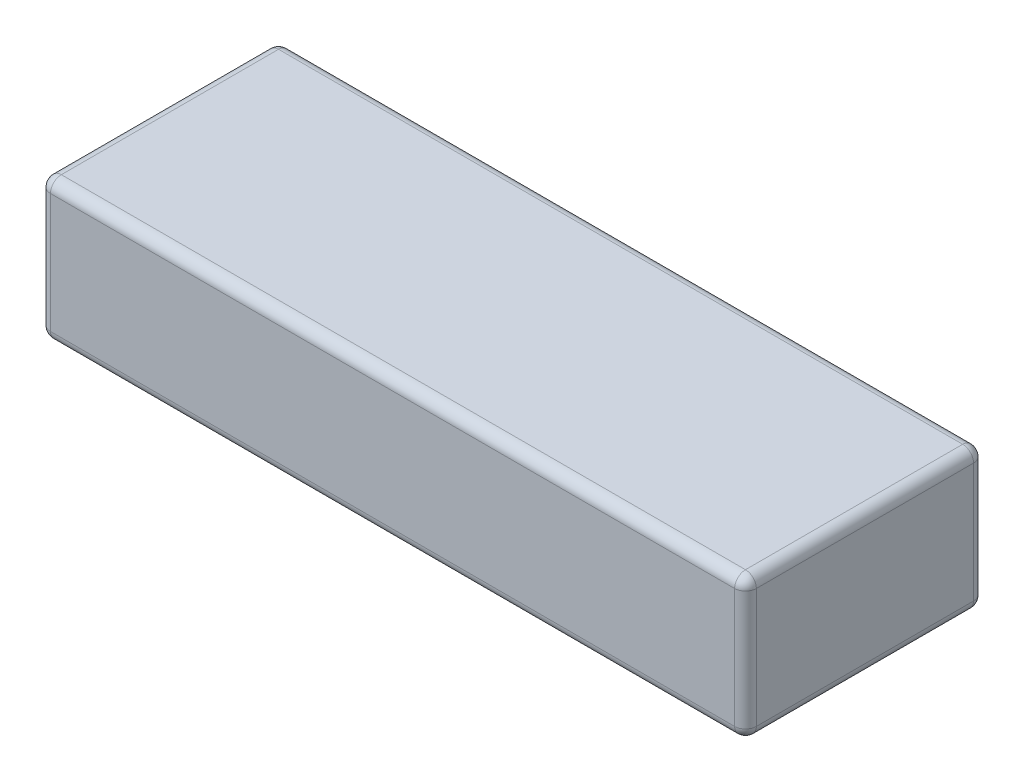
ISO-10303-21;
HEADER;
FILE_DESCRIPTION(('STEP AP214'),'2;1');
FILE_NAME('part.step','',(''),(''),'','','');
FILE_SCHEMA(('AUTOMOTIVE_DESIGN { 1 0 10303 214 1 1 1 1 }'));
ENDSEC;
DATA;
#1=APPLICATION_CONTEXT('core data for automotive mechanical design processes');
#2=APPLICATION_PROTOCOL_DEFINITION('international standard','automotive_design',2000,#1);
#3=PRODUCT_CONTEXT('',#1,'mechanical');
#4=PRODUCT('Part','Part','',(#3));
#5=PRODUCT_RELATED_PRODUCT_CATEGORY('part','',(#4));
#6=PRODUCT_DEFINITION_FORMATION('','',#4);
#7=PRODUCT_DEFINITION_CONTEXT('part definition',#1,'design');
#8=PRODUCT_DEFINITION('design','',#6,#7);
#9=PRODUCT_DEFINITION_SHAPE('','',#8);
#10=(LENGTH_UNIT() NAMED_UNIT(*) SI_UNIT(.MILLI.,.METRE.));
#11=(NAMED_UNIT(*) PLANE_ANGLE_UNIT() SI_UNIT($,.RADIAN.));
#12=(NAMED_UNIT(*) SI_UNIT($,.STERADIAN.) SOLID_ANGLE_UNIT());
#13=UNCERTAINTY_MEASURE_WITH_UNIT(LENGTH_MEASURE(1.E-05),#10,'distance_accuracy_value','');
#14=(GEOMETRIC_REPRESENTATION_CONTEXT(3) GLOBAL_UNCERTAINTY_ASSIGNED_CONTEXT((#13)) GLOBAL_UNIT_ASSIGNED_CONTEXT((#10,
#11,#12)) REPRESENTATION_CONTEXT('',''));
#15=CARTESIAN_POINT('',(0.,0.,0.));
#16=DIRECTION('',(0.,0.,1.));
#17=DIRECTION('',(1.,0.,0.));
#18=AXIS2_PLACEMENT_3D('',#15,#16,#17);
#19=CARTESIAN_POINT('',(-61.7927631578948,26.,-27.4292763157895));
#20=DIRECTION('',(1.,0.,0.));
#21=DIRECTION('',(0.,0.,-1.));
#22=AXIS2_PLACEMENT_3D('',#19,#20,#21);
#23=PLANE('',#22);
#24=DIRECTION('',(0.,0.,1.));
#25=VECTOR('',#24,1.);
#26=CARTESIAN_POINT('',(-61.7927631578948,2.,-27.4292763157895));
#27=LINE('',#26,#25);
#28=CARTESIAN_POINT('',(-61.7927631578948,2.,-25.4292763157895));
#29=VERTEX_POINT('',#28);
#30=CARTESIAN_POINT('',(-61.7927631578948,2.,14.5707236842105));
#31=VERTEX_POINT('',#30);
#32=EDGE_CURVE('E188',#29,#31,#27,.T.);
#33=ORIENTED_EDGE('',*,*,#32,.T.);
#34=DIRECTION('',(0.,-1.,0.));
#35=VECTOR('',#34,1.);
#36=CARTESIAN_POINT('',(-61.7927631578948,26.,14.5707236842105));
#37=LINE('',#36,#35);
#38=CARTESIAN_POINT('',(-61.7927631578948,24.,14.5707236842105));
#39=VERTEX_POINT('',#38);
#40=EDGE_CURVE('E191',#31,#39,#37,.F.);
#41=ORIENTED_EDGE('',*,*,#40,.T.);
#42=DIRECTION('',(0.,0.,1.));
#43=VECTOR('',#42,1.);
#44=CARTESIAN_POINT('',(-61.7927631578948,24.,-27.4292763157895));
#45=LINE('',#44,#43);
#46=CARTESIAN_POINT('',(-61.7927631578948,24.,-25.4292763157895));
#47=VERTEX_POINT('',#46);
#48=EDGE_CURVE('E185',#39,#47,#45,.F.);
#49=ORIENTED_EDGE('',*,*,#48,.T.);
#50=DIRECTION('',(0.,-1.,0.));
#51=VECTOR('',#50,1.);
#52=CARTESIAN_POINT('',(-61.7927631578948,26.,-25.4292763157895));
#53=LINE('',#52,#51);
#54=EDGE_CURVE('E182',#47,#29,#53,.T.);
#55=ORIENTED_EDGE('',*,*,#54,.T.);
#56=EDGE_LOOP('',(#33,#41,#49,#55));
#57=FACE_BOUND('',#56,.T.);
#58=ADVANCED_FACE('F45',(#57),#23,.F.);
#59=CARTESIAN_POINT('',(-61.7927631578948,26.,16.5707236842105));
#60=DIRECTION('',(0.,0.,-1.));
#61=DIRECTION('',(-1.,0.,0.));
#62=AXIS2_PLACEMENT_3D('',#59,#60,#61);
#63=PLANE('',#62);
#64=DIRECTION('',(1.,0.,0.));
#65=VECTOR('',#64,1.);
#66=CARTESIAN_POINT('',(-61.7927631578948,24.,16.5707236842105));
#67=LINE('',#66,#65);
#68=CARTESIAN_POINT('',(66.2072368421052,24.,16.5707236842105));
#69=VERTEX_POINT('',#68);
#70=CARTESIAN_POINT('',(-59.7927631578948,24.,16.5707236842105));
#71=VERTEX_POINT('',#70);
#72=EDGE_CURVE('E138',#69,#71,#67,.F.);
#73=ORIENTED_EDGE('',*,*,#72,.T.);
#74=DIRECTION('',(0.,-1.,0.));
#75=VECTOR('',#74,1.);
#76=CARTESIAN_POINT('',(-59.7927631578948,26.,16.5707236842105));
#77=LINE('',#76,#75);
#78=CARTESIAN_POINT('',(-59.7927631578948,2.,16.5707236842105));
#79=VERTEX_POINT('',#78);
#80=EDGE_CURVE('E179',#71,#79,#77,.T.);
#81=ORIENTED_EDGE('',*,*,#80,.T.);
#82=DIRECTION('',(1.,0.,0.));
#83=VECTOR('',#82,1.);
#84=CARTESIAN_POINT('',(-61.7927631578948,2.,16.5707236842105));
#85=LINE('',#84,#83);
#86=CARTESIAN_POINT('',(66.2072368421052,2.,16.5707236842105));
#87=VERTEX_POINT('',#86);
#88=EDGE_CURVE('E141',#79,#87,#85,.T.);
#89=ORIENTED_EDGE('',*,*,#88,.T.);
#90=DIRECTION('',(0.,-1.,0.));
#91=VECTOR('',#90,1.);
#92=CARTESIAN_POINT('',(66.2072368421052,26.,16.5707236842105));
#93=LINE('',#92,#91);
#94=EDGE_CURVE('E133',#87,#69,#93,.F.);
#95=ORIENTED_EDGE('',*,*,#94,.T.);
#96=EDGE_LOOP('',(#73,#81,#89,#95));
#97=FACE_BOUND('',#96,.T.);
#98=ADVANCED_FACE('F135',(#97),#63,.F.);
#99=CARTESIAN_POINT('',(68.2072368421052,26.,-27.4292763157895));
#100=DIRECTION('',(-1.,0.,0.));
#101=DIRECTION('',(0.,0.,1.));
#102=AXIS2_PLACEMENT_3D('',#99,#100,#101);
#103=PLANE('',#102);
#104=DIRECTION('',(0.,0.,-1.));
#105=VECTOR('',#104,1.);
#106=CARTESIAN_POINT('',(68.2072368421052,2.,-27.4292763157895));
#107=LINE('',#106,#105);
#108=CARTESIAN_POINT('',(68.2072368421052,2.,14.5707236842105));
#109=VERTEX_POINT('',#108);
#110=CARTESIAN_POINT('',(68.2072368421052,2.,-25.4292763157895));
#111=VERTEX_POINT('',#110);
#112=EDGE_CURVE('E55',#109,#111,#107,.T.);
#113=ORIENTED_EDGE('',*,*,#112,.T.);
#114=DIRECTION('',(0.,-1.,0.));
#115=VECTOR('',#114,1.);
#116=CARTESIAN_POINT('',(68.2072368421052,26.,-25.4292763157895));
#117=LINE('',#116,#115);
#118=CARTESIAN_POINT('',(68.2072368421052,24.,-25.4292763157895));
#119=VERTEX_POINT('',#118);
#120=EDGE_CURVE('E11',#111,#119,#117,.F.);
#121=ORIENTED_EDGE('',*,*,#120,.T.);
#122=DIRECTION('',(0.,0.,-1.));
#123=VECTOR('',#122,1.);
#124=CARTESIAN_POINT('',(68.2072368421052,24.,16.5707236842105));
#125=LINE('',#124,#123);
#126=CARTESIAN_POINT('',(68.2072368421052,24.,14.5707236842105));
#127=VERTEX_POINT('',#126);
#128=EDGE_CURVE('E234',#119,#127,#125,.F.);
#129=ORIENTED_EDGE('',*,*,#128,.T.);
#130=DIRECTION('',(0.,-1.,0.));
#131=VECTOR('',#130,1.);
#132=CARTESIAN_POINT('',(68.2072368421052,26.,14.5707236842105));
#133=LINE('',#132,#131);
#134=EDGE_CURVE('E66',#127,#109,#133,.T.);
#135=ORIENTED_EDGE('',*,*,#134,.T.);
#136=EDGE_LOOP('',(#113,#121,#129,#135));
#137=FACE_BOUND('',#136,.T.);
#138=ADVANCED_FACE('F370',(#137),#103,.F.);
#139=CARTESIAN_POINT('',(-61.7927631578948,26.,-27.4292763157895));
#140=DIRECTION('',(0.,0.,1.));
#141=DIRECTION('',(1.,0.,0.));
#142=AXIS2_PLACEMENT_3D('',#139,#140,#141);
#143=PLANE('',#142);
#144=DIRECTION('',(0.,-1.,0.));
#145=VECTOR('',#144,1.);
#146=CARTESIAN_POINT('',(-59.7927631578948,26.,-27.4292763157895));
#147=LINE('',#146,#145);
#148=CARTESIAN_POINT('',(-59.7927631578948,2.,-27.4292763157895));
#149=VERTEX_POINT('',#148);
#150=CARTESIAN_POINT('',(-59.7927631578948,24.,-27.4292763157895));
#151=VERTEX_POINT('',#150);
#152=EDGE_CURVE('E227',#149,#151,#147,.F.);
#153=ORIENTED_EDGE('',*,*,#152,.T.);
#154=DIRECTION('',(-1.,0.,0.));
#155=VECTOR('',#154,1.);
#156=CARTESIAN_POINT('',(68.2072368421052,24.,-27.4292763157895));
#157=LINE('',#156,#155);
#158=CARTESIAN_POINT('',(66.2072368421052,24.,-27.4292763157895));
#159=VERTEX_POINT('',#158);
#160=EDGE_CURVE('E230',#151,#159,#157,.F.);
#161=ORIENTED_EDGE('',*,*,#160,.T.);
#162=DIRECTION('',(0.,-1.,0.));
#163=VECTOR('',#162,1.);
#164=CARTESIAN_POINT('',(66.2072368421052,26.,-27.4292763157895));
#165=LINE('',#164,#163);
#166=CARTESIAN_POINT('',(66.2072368421052,2.,-27.4292763157895));
#167=VERTEX_POINT('',#166);
#168=EDGE_CURVE('E221',#159,#167,#165,.T.);
#169=ORIENTED_EDGE('',*,*,#168,.T.);
#170=DIRECTION('',(-1.,0.,0.));
#171=VECTOR('',#170,1.);
#172=CARTESIAN_POINT('',(-61.7927631578948,2.,-27.4292763157895));
#173=LINE('',#172,#171);
#174=EDGE_CURVE('E224',#167,#149,#173,.T.);
#175=ORIENTED_EDGE('',*,*,#174,.T.);
#176=EDGE_LOOP('',(#153,#161,#169,#175));
#177=FACE_BOUND('',#176,.T.);
#178=ADVANCED_FACE('F333',(#177),#143,.F.);
#179=CARTESIAN_POINT('',(0.,26.,0.));
#180=DIRECTION('',(0.,1.,0.));
#181=DIRECTION('',(0.,0.,1.));
#182=AXIS2_PLACEMENT_3D('',#179,#180,#181);
#183=PLANE('',#182);
#184=DIRECTION('',(0.,0.,-1.));
#185=VECTOR('',#184,1.);
#186=CARTESIAN_POINT('',(66.2072368421052,26.,-27.4292763157895));
#187=LINE('',#186,#185);
#188=CARTESIAN_POINT('',(66.2072368421052,26.,14.5707236842105));
#189=VERTEX_POINT('',#188);
#190=CARTESIAN_POINT('',(66.2072368421052,26.,-25.4292763157895));
#191=VERTEX_POINT('',#190);
#192=EDGE_CURVE('E211',#189,#191,#187,.T.);
#193=ORIENTED_EDGE('',*,*,#192,.T.);
#194=DIRECTION('',(-1.,0.,0.));
#195=VECTOR('',#194,1.);
#196=CARTESIAN_POINT('',(-61.7927631578948,26.,-25.4292763157895));
#197=LINE('',#196,#195);
#198=CARTESIAN_POINT('',(-59.7927631578948,26.,-25.4292763157895));
#199=VERTEX_POINT('',#198);
#200=EDGE_CURVE('E217',#191,#199,#197,.T.);
#201=ORIENTED_EDGE('',*,*,#200,.T.);
#202=DIRECTION('',(0.,0.,1.));
#203=VECTOR('',#202,1.);
#204=CARTESIAN_POINT('',(-59.7927631578948,26.,16.5707236842105));
#205=LINE('',#204,#203);
#206=CARTESIAN_POINT('',(-59.7927631578948,26.,14.5707236842105));
#207=VERTEX_POINT('',#206);
#208=EDGE_CURVE('E214',#199,#207,#205,.T.);
#209=ORIENTED_EDGE('',*,*,#208,.T.);
#210=DIRECTION('',(1.,0.,0.));
#211=VECTOR('',#210,1.);
#212=CARTESIAN_POINT('',(68.2072368421052,26.,14.5707236842105));
#213=LINE('',#212,#211);
#214=EDGE_CURVE('E208',#207,#189,#213,.T.);
#215=ORIENTED_EDGE('',*,*,#214,.T.);
#216=EDGE_LOOP('',(#193,#201,#209,#215));
#217=FACE_BOUND('',#216,.T.);
#218=ADVANCED_FACE('F349',(#217),#183,.T.);
#219=CARTESIAN_POINT('',(0.,0.,0.));
#220=DIRECTION('',(0.,1.,0.));
#221=DIRECTION('',(0.,0.,1.));
#222=AXIS2_PLACEMENT_3D('',#219,#220,#221);
#223=PLANE('',#222);
#224=DIRECTION('',(1.,0.,0.));
#225=VECTOR('',#224,1.);
#226=CARTESIAN_POINT('',(0.,0.,14.5707236842105));
#227=LINE('',#226,#225);
#228=CARTESIAN_POINT('',(66.2072368421052,0.,14.5707236842105));
#229=VERTEX_POINT('',#228);
#230=CARTESIAN_POINT('',(-59.7927631578948,0.,14.5707236842105));
#231=VERTEX_POINT('',#230);
#232=EDGE_CURVE('E198',#229,#231,#227,.F.);
#233=ORIENTED_EDGE('',*,*,#232,.T.);
#234=DIRECTION('',(0.,0.,1.));
#235=VECTOR('',#234,1.);
#236=CARTESIAN_POINT('',(-59.7927631578948,0.,0.));
#237=LINE('',#236,#235);
#238=CARTESIAN_POINT('',(-59.7927631578948,0.,-25.4292763157895));
#239=VERTEX_POINT('',#238);
#240=EDGE_CURVE('E204',#231,#239,#237,.F.);
#241=ORIENTED_EDGE('',*,*,#240,.T.);
#242=DIRECTION('',(-1.,0.,0.));
#243=VECTOR('',#242,1.);
#244=CARTESIAN_POINT('',(0.,0.,-25.4292763157895));
#245=LINE('',#244,#243);
#246=CARTESIAN_POINT('',(66.2072368421052,0.,-25.4292763157895));
#247=VERTEX_POINT('',#246);
#248=EDGE_CURVE('E201',#239,#247,#245,.F.);
#249=ORIENTED_EDGE('',*,*,#248,.T.);
#250=DIRECTION('',(0.,0.,-1.));
#251=VECTOR('',#250,1.);
#252=CARTESIAN_POINT('',(66.2072368421052,0.,0.));
#253=LINE('',#252,#251);
#254=EDGE_CURVE('E195',#247,#229,#253,.F.);
#255=ORIENTED_EDGE('',*,*,#254,.T.);
#256=EDGE_LOOP('',(#233,#241,#249,#255));
#257=FACE_BOUND('',#256,.T.);
#258=ADVANCED_FACE('F324',(#257),#223,.F.);
#259=CARTESIAN_POINT('',(66.2072368421052,26.,-25.4292763157895));
#260=DIRECTION('',(0.,-1.,0.));
#261=DIRECTION('',(0.,0.,-1.));
#262=AXIS2_PLACEMENT_3D('',#259,#260,#261);
#263=CYLINDRICAL_SURFACE('',#262,2.);
#264=CARTESIAN_POINT('',(66.2072368421052,24.,-25.4292763157895));
#265=DIRECTION('',(0.,1.,0.));
#266=DIRECTION('',(0.,0.,1.));
#267=AXIS2_PLACEMENT_3D('',#264,#265,#266);
#268=CIRCLE('',#267,2.);
#269=EDGE_CURVE('E49',#119,#159,#268,.T.);
#270=ORIENTED_EDGE('',*,*,#269,.F.);
#271=ORIENTED_EDGE('',*,*,#120,.F.);
#272=CARTESIAN_POINT('',(66.2072368421052,2.,-25.4292763157895));
#273=DIRECTION('',(0.,-1.,0.));
#274=DIRECTION('',(0.,0.,-1.));
#275=AXIS2_PLACEMENT_3D('',#272,#273,#274);
#276=CIRCLE('',#275,2.);
#277=EDGE_CURVE('E175',#167,#111,#276,.T.);
#278=ORIENTED_EDGE('',*,*,#277,.F.);
#279=ORIENTED_EDGE('',*,*,#168,.F.);
#280=EDGE_LOOP('',(#270,#271,#278,#279));
#281=FACE_BOUND('',#280,.T.);
#282=ADVANCED_FACE('F47',(#281),#263,.T.);
#283=CARTESIAN_POINT('',(66.2072368421052,24.,-25.4292763157895));
#284=DIRECTION('',(0.,0.,-1.));
#285=DIRECTION('',(-1.,0.,0.));
#286=AXIS2_PLACEMENT_3D('',#283,#284,#285);
#287=SPHERICAL_SURFACE('',#286,2.);
#288=CARTESIAN_POINT('',(66.2072368421052,24.,-25.4292763157895));
#289=DIRECTION('',(0.,0.,-1.));
#290=DIRECTION('',(-1.,0.,0.));
#291=AXIS2_PLACEMENT_3D('',#288,#289,#290);
#292=CIRCLE('',#291,2.);
#293=EDGE_CURVE('E302',#119,#191,#292,.F.);
#294=ORIENTED_EDGE('',*,*,#293,.F.);
#295=ORIENTED_EDGE('',*,*,#269,.T.);
#296=CARTESIAN_POINT('',(66.2072368421052,24.,-25.4292763157895));
#297=DIRECTION('',(1.,0.,0.));
#298=DIRECTION('',(0.,1.,0.));
#299=AXIS2_PLACEMENT_3D('',#296,#297,#298);
#300=CIRCLE('',#299,2.);
#301=EDGE_CURVE('E306',#191,#159,#300,.F.);
#302=ORIENTED_EDGE('',*,*,#301,.F.);
#303=EDGE_LOOP('',(#294,#295,#302));
#304=FACE_BOUND('',#303,.T.);
#305=ADVANCED_FACE('F357',(#304),#287,.T.);
#306=CARTESIAN_POINT('',(66.2072368421052,2.,-25.4292763157895));
#307=DIRECTION('',(1.,0.,0.));
#308=DIRECTION('',(0.,1.,0.));
#309=AXIS2_PLACEMENT_3D('',#306,#307,#308);
#310=SPHERICAL_SURFACE('',#309,2.);
#311=CARTESIAN_POINT('',(66.2072368421052,2.,-25.4292763157895));
#312=DIRECTION('',(1.,0.,0.));
#313=DIRECTION('',(0.,0.,-1.));
#314=AXIS2_PLACEMENT_3D('',#311,#312,#313);
#315=CIRCLE('',#314,2.);
#316=EDGE_CURVE('E294',#167,#247,#315,.F.);
#317=ORIENTED_EDGE('',*,*,#316,.F.);
#318=ORIENTED_EDGE('',*,*,#277,.T.);
#319=CARTESIAN_POINT('',(66.2072368421052,2.,-25.4292763157895));
#320=DIRECTION('',(0.,0.,-1.));
#321=DIRECTION('',(-1.,0.,0.));
#322=AXIS2_PLACEMENT_3D('',#319,#320,#321);
#323=CIRCLE('',#322,2.);
#324=EDGE_CURVE('E298',#247,#111,#323,.F.);
#325=ORIENTED_EDGE('',*,*,#324,.F.);
#326=EDGE_LOOP('',(#317,#318,#325));
#327=FACE_BOUND('',#326,.T.);
#328=ADVANCED_FACE('F314',(#327),#310,.T.);
#329=CARTESIAN_POINT('',(0.,24.,-25.4292763157895));
#330=DIRECTION('',(1.,0.,0.));
#331=DIRECTION('',(0.,0.,-1.));
#332=AXIS2_PLACEMENT_3D('',#329,#330,#331);
#333=CYLINDRICAL_SURFACE('',#332,2.);
#334=ORIENTED_EDGE('',*,*,#301,.T.);
#335=ORIENTED_EDGE('',*,*,#160,.F.);
#336=CARTESIAN_POINT('',(-59.7927631578948,24.,-25.4292763157895));
#337=DIRECTION('',(-1.,0.,0.));
#338=DIRECTION('',(0.,0.,1.));
#339=AXIS2_PLACEMENT_3D('',#336,#337,#338);
#340=CIRCLE('',#339,2.);
#341=EDGE_CURVE('E286',#199,#151,#340,.T.);
#342=ORIENTED_EDGE('',*,*,#341,.F.);
#343=ORIENTED_EDGE('',*,*,#200,.F.);
#344=EDGE_LOOP('',(#334,#335,#342,#343));
#345=FACE_BOUND('',#344,.T.);
#346=ADVANCED_FACE('F347',(#345),#333,.T.);
#347=CARTESIAN_POINT('',(66.2072368421052,24.,0.));
#348=DIRECTION('',(0.,0.,1.));
#349=DIRECTION('',(1.,0.,0.));
#350=AXIS2_PLACEMENT_3D('',#347,#348,#349);
#351=CYLINDRICAL_SURFACE('',#350,2.);
#352=ORIENTED_EDGE('',*,*,#293,.T.);
#353=ORIENTED_EDGE('',*,*,#192,.F.);
#354=CARTESIAN_POINT('',(66.2072368421052,24.,14.5707236842105));
#355=DIRECTION('',(0.,0.,1.));
#356=DIRECTION('',(0.,-1.,0.));
#357=AXIS2_PLACEMENT_3D('',#354,#355,#356);
#358=CIRCLE('',#357,2.);
#359=EDGE_CURVE('E155',#127,#189,#358,.T.);
#360=ORIENTED_EDGE('',*,*,#359,.F.);
#361=ORIENTED_EDGE('',*,*,#128,.F.);
#362=EDGE_LOOP('',(#352,#353,#360,#361));
#363=FACE_BOUND('',#362,.T.);
#364=ADVANCED_FACE('F354',(#363),#351,.T.);
#365=CARTESIAN_POINT('',(66.2072368421052,26.,14.5707236842105));
#366=DIRECTION('',(0.,-1.,0.));
#367=DIRECTION('',(0.,0.,-1.));
#368=AXIS2_PLACEMENT_3D('',#365,#366,#367);
#369=CYLINDRICAL_SURFACE('',#368,2.);
#370=CARTESIAN_POINT('',(66.2072368421052,2.,14.5707236842105));
#371=DIRECTION('',(0.,-1.,0.));
#372=DIRECTION('',(0.,0.,-1.));
#373=AXIS2_PLACEMENT_3D('',#370,#371,#372);
#374=CIRCLE('',#373,2.);
#375=EDGE_CURVE('E156',#109,#87,#374,.T.);
#376=ORIENTED_EDGE('',*,*,#375,.F.);
#377=ORIENTED_EDGE('',*,*,#134,.F.);
#378=CARTESIAN_POINT('',(66.2072368421052,24.,14.5707236842105));
#379=DIRECTION('',(0.,1.,0.));
#380=DIRECTION('',(0.,0.,1.));
#381=AXIS2_PLACEMENT_3D('',#378,#379,#380);
#382=CIRCLE('',#381,2.);
#383=EDGE_CURVE('E148',#69,#127,#382,.T.);
#384=ORIENTED_EDGE('',*,*,#383,.F.);
#385=ORIENTED_EDGE('',*,*,#94,.F.);
#386=EDGE_LOOP('',(#376,#377,#384,#385));
#387=FACE_BOUND('',#386,.T.);
#388=ADVANCED_FACE('F150',(#387),#369,.T.);
#389=CARTESIAN_POINT('',(66.2072368421052,2.,-27.4292763157895));
#390=DIRECTION('',(0.,0.,-1.));
#391=DIRECTION('',(-1.,0.,0.));
#392=AXIS2_PLACEMENT_3D('',#389,#390,#391);
#393=CYLINDRICAL_SURFACE('',#392,2.);
#394=ORIENTED_EDGE('',*,*,#324,.T.);
#395=ORIENTED_EDGE('',*,*,#112,.F.);
#396=CARTESIAN_POINT('',(66.2072368421052,2.,14.5707236842105));
#397=DIRECTION('',(0.,0.,1.));
#398=DIRECTION('',(1.,0.,0.));
#399=AXIS2_PLACEMENT_3D('',#396,#397,#398);
#400=CIRCLE('',#399,2.);
#401=EDGE_CURVE('E278',#229,#109,#400,.T.);
#402=ORIENTED_EDGE('',*,*,#401,.F.);
#403=ORIENTED_EDGE('',*,*,#254,.F.);
#404=EDGE_LOOP('',(#394,#395,#402,#403));
#405=FACE_BOUND('',#404,.T.);
#406=ADVANCED_FACE('F320',(#405),#393,.T.);
#407=CARTESIAN_POINT('',(-61.7927631578948,2.,-25.4292763157895));
#408=DIRECTION('',(-1.,0.,0.));
#409=DIRECTION('',(0.,0.,1.));
#410=AXIS2_PLACEMENT_3D('',#407,#408,#409);
#411=CYLINDRICAL_SURFACE('',#410,2.);
#412=ORIENTED_EDGE('',*,*,#316,.T.);
#413=ORIENTED_EDGE('',*,*,#248,.F.);
#414=CARTESIAN_POINT('',(-59.7927631578948,2.,-25.4292763157895));
#415=DIRECTION('',(-1.,0.,0.));
#416=DIRECTION('',(0.,0.,1.));
#417=AXIS2_PLACEMENT_3D('',#414,#415,#416);
#418=CIRCLE('',#417,2.);
#419=EDGE_CURVE('E274',#149,#239,#418,.T.);
#420=ORIENTED_EDGE('',*,*,#419,.F.);
#421=ORIENTED_EDGE('',*,*,#174,.F.);
#422=EDGE_LOOP('',(#412,#413,#420,#421));
#423=FACE_BOUND('',#422,.T.);
#424=ADVANCED_FACE('F330',(#423),#411,.T.);
#425=CARTESIAN_POINT('',(-59.7927631578948,26.,-25.4292763157895));
#426=DIRECTION('',(0.,-1.,0.));
#427=DIRECTION('',(0.,0.,-1.));
#428=AXIS2_PLACEMENT_3D('',#425,#426,#427);
#429=CYLINDRICAL_SURFACE('',#428,2.);
#430=CARTESIAN_POINT('',(-59.7927631578948,24.,-25.4292763157895));
#431=DIRECTION('',(0.,1.,0.));
#432=DIRECTION('',(0.,0.,1.));
#433=AXIS2_PLACEMENT_3D('',#430,#431,#432);
#434=CIRCLE('',#433,2.);
#435=EDGE_CURVE('E290',#151,#47,#434,.T.);
#436=ORIENTED_EDGE('',*,*,#435,.F.);
#437=ORIENTED_EDGE('',*,*,#152,.F.);
#438=CARTESIAN_POINT('',(-59.7927631578948,2.,-25.4292763157895));
#439=DIRECTION('',(0.,-1.,0.));
#440=DIRECTION('',(0.,0.,-1.));
#441=AXIS2_PLACEMENT_3D('',#438,#439,#440);
#442=CIRCLE('',#441,2.);
#443=EDGE_CURVE('E270',#29,#149,#442,.T.);
#444=ORIENTED_EDGE('',*,*,#443,.F.);
#445=ORIENTED_EDGE('',*,*,#54,.F.);
#446=EDGE_LOOP('',(#436,#437,#444,#445));
#447=FACE_BOUND('',#446,.T.);
#448=ADVANCED_FACE('F338',(#447),#429,.T.);
#449=CARTESIAN_POINT('',(-59.7927631578948,24.,-25.4292763157895));
#450=DIRECTION('',(0.,0.,-1.));
#451=DIRECTION('',(-1.,0.,0.));
#452=AXIS2_PLACEMENT_3D('',#449,#450,#451);
#453=SPHERICAL_SURFACE('',#452,2.);
#454=ORIENTED_EDGE('',*,*,#341,.T.);
#455=ORIENTED_EDGE('',*,*,#435,.T.);
#456=CARTESIAN_POINT('',(-59.7927631578948,24.,-25.4292763157895));
#457=DIRECTION('',(0.,0.,-1.));
#458=DIRECTION('',(-1.,0.,0.));
#459=AXIS2_PLACEMENT_3D('',#456,#457,#458);
#460=CIRCLE('',#459,2.);
#461=EDGE_CURVE('E164',#199,#47,#460,.F.);
#462=ORIENTED_EDGE('',*,*,#461,.F.);
#463=EDGE_LOOP('',(#454,#455,#462));
#464=FACE_BOUND('',#463,.T.);
#465=ADVANCED_FACE('F344',(#464),#453,.T.);
#466=CARTESIAN_POINT('',(66.2072368421052,24.,14.5707236842105));
#467=DIRECTION('',(1.,0.,0.));
#468=DIRECTION('',(0.,0.,-1.));
#469=AXIS2_PLACEMENT_3D('',#466,#467,#468);
#470=SPHERICAL_SURFACE('',#469,2.);
#471=ORIENTED_EDGE('',*,*,#383,.T.);
#472=ORIENTED_EDGE('',*,*,#359,.T.);
#473=CARTESIAN_POINT('',(66.2072368421052,24.,14.5707236842105));
#474=DIRECTION('',(1.,0.,0.));
#475=DIRECTION('',(0.,0.,-1.));
#476=AXIS2_PLACEMENT_3D('',#473,#474,#475);
#477=CIRCLE('',#476,2.);
#478=EDGE_CURVE('E159',#69,#189,#477,.F.);
#479=ORIENTED_EDGE('',*,*,#478,.F.);
#480=EDGE_LOOP('',(#471,#472,#479));
#481=FACE_BOUND('',#480,.T.);
#482=ADVANCED_FACE('F160',(#481),#470,.T.);
#483=CARTESIAN_POINT('',(66.2072368421052,2.,14.5707236842105));
#484=DIRECTION('',(1.,0.,0.));
#485=DIRECTION('',(0.,0.,-1.));
#486=AXIS2_PLACEMENT_3D('',#483,#484,#485);
#487=SPHERICAL_SURFACE('',#486,2.);
#488=ORIENTED_EDGE('',*,*,#401,.T.);
#489=ORIENTED_EDGE('',*,*,#375,.T.);
#490=CARTESIAN_POINT('',(66.2072368421052,2.,14.5707236842105));
#491=DIRECTION('',(1.,0.,0.));
#492=DIRECTION('',(0.,0.,-1.));
#493=AXIS2_PLACEMENT_3D('',#490,#491,#492);
#494=CIRCLE('',#493,2.);
#495=EDGE_CURVE('E165',#229,#87,#494,.F.);
#496=ORIENTED_EDGE('',*,*,#495,.F.);
#497=EDGE_LOOP('',(#488,#489,#496));
#498=FACE_BOUND('',#497,.T.);
#499=ADVANCED_FACE('F403',(#498),#487,.T.);
#500=CARTESIAN_POINT('',(-59.7927631578948,2.,-25.4292763157895));
#501=DIRECTION('',(0.,0.,-1.));
#502=DIRECTION('',(0.,1.,0.));
#503=AXIS2_PLACEMENT_3D('',#500,#501,#502);
#504=SPHERICAL_SURFACE('',#503,2.);
#505=ORIENTED_EDGE('',*,*,#443,.T.);
#506=ORIENTED_EDGE('',*,*,#419,.T.);
#507=CARTESIAN_POINT('',(-59.7927631578948,2.,-25.4292763157895));
#508=DIRECTION('',(0.,0.,-1.));
#509=DIRECTION('',(-1.,0.,0.));
#510=AXIS2_PLACEMENT_3D('',#507,#508,#509);
#511=CIRCLE('',#510,2.);
#512=EDGE_CURVE('E261',#29,#239,#511,.F.);
#513=ORIENTED_EDGE('',*,*,#512,.F.);
#514=EDGE_LOOP('',(#505,#506,#513));
#515=FACE_BOUND('',#514,.T.);
#516=ADVANCED_FACE('F399',(#515),#504,.T.);
#517=CARTESIAN_POINT('',(-59.7927631578948,24.,0.));
#518=DIRECTION('',(0.,0.,-1.));
#519=DIRECTION('',(-1.,0.,0.));
#520=AXIS2_PLACEMENT_3D('',#517,#518,#519);
#521=CYLINDRICAL_SURFACE('',#520,2.);
#522=ORIENTED_EDGE('',*,*,#461,.T.);
#523=ORIENTED_EDGE('',*,*,#48,.F.);
#524=CARTESIAN_POINT('',(-59.7927631578948,24.,14.5707236842105));
#525=DIRECTION('',(0.,0.,1.));
#526=DIRECTION('',(1.,0.,0.));
#527=AXIS2_PLACEMENT_3D('',#524,#525,#526);
#528=CIRCLE('',#527,2.);
#529=EDGE_CURVE('E257',#207,#39,#528,.T.);
#530=ORIENTED_EDGE('',*,*,#529,.F.);
#531=ORIENTED_EDGE('',*,*,#208,.F.);
#532=EDGE_LOOP('',(#522,#523,#530,#531));
#533=FACE_BOUND('',#532,.T.);
#534=ADVANCED_FACE('F396',(#533),#521,.T.);
#535=CARTESIAN_POINT('',(0.,24.,14.5707236842105));
#536=DIRECTION('',(-1.,0.,0.));
#537=DIRECTION('',(0.,0.,1.));
#538=AXIS2_PLACEMENT_3D('',#535,#536,#537);
#539=CYLINDRICAL_SURFACE('',#538,2.);
#540=ORIENTED_EDGE('',*,*,#478,.T.);
#541=ORIENTED_EDGE('',*,*,#214,.F.);
#542=CARTESIAN_POINT('',(-59.7927631578948,24.,14.5707236842105));
#543=DIRECTION('',(-1.,0.,0.));
#544=DIRECTION('',(0.,0.,1.));
#545=AXIS2_PLACEMENT_3D('',#542,#543,#544);
#546=CIRCLE('',#545,2.);
#547=EDGE_CURVE('E169',#71,#207,#546,.T.);
#548=ORIENTED_EDGE('',*,*,#547,.F.);
#549=ORIENTED_EDGE('',*,*,#72,.F.);
#550=EDGE_LOOP('',(#540,#541,#548,#549));
#551=FACE_BOUND('',#550,.T.);
#552=ADVANCED_FACE('F167',(#551),#539,.T.);
#553=CARTESIAN_POINT('',(-61.7927631578948,2.,14.5707236842105));
#554=DIRECTION('',(1.,0.,0.));
#555=DIRECTION('',(0.,0.,-1.));
#556=AXIS2_PLACEMENT_3D('',#553,#554,#555);
#557=CYLINDRICAL_SURFACE('',#556,2.);
#558=ORIENTED_EDGE('',*,*,#495,.T.);
#559=ORIENTED_EDGE('',*,*,#88,.F.);
#560=CARTESIAN_POINT('',(-59.7927631578948,2.,14.5707236842105));
#561=DIRECTION('',(-1.,0.,0.));
#562=DIRECTION('',(0.,0.,1.));
#563=AXIS2_PLACEMENT_3D('',#560,#561,#562);
#564=CIRCLE('',#563,2.);
#565=EDGE_CURVE('E251',#231,#79,#564,.T.);
#566=ORIENTED_EDGE('',*,*,#565,.F.);
#567=ORIENTED_EDGE('',*,*,#232,.F.);
#568=EDGE_LOOP('',(#558,#559,#566,#567));
#569=FACE_BOUND('',#568,.T.);
#570=ADVANCED_FACE('F389',(#569),#557,.T.);
#571=CARTESIAN_POINT('',(-59.7927631578948,2.,-27.4292763157895));
#572=DIRECTION('',(0.,0.,1.));
#573=DIRECTION('',(1.,0.,0.));
#574=AXIS2_PLACEMENT_3D('',#571,#572,#573);
#575=CYLINDRICAL_SURFACE('',#574,2.);
#576=ORIENTED_EDGE('',*,*,#512,.T.);
#577=ORIENTED_EDGE('',*,*,#240,.F.);
#578=CARTESIAN_POINT('',(-59.7927631578948,2.,14.5707236842105));
#579=DIRECTION('',(0.,0.,1.));
#580=DIRECTION('',(1.,0.,0.));
#581=AXIS2_PLACEMENT_3D('',#578,#579,#580);
#582=CIRCLE('',#581,2.);
#583=EDGE_CURVE('E247',#31,#231,#582,.T.);
#584=ORIENTED_EDGE('',*,*,#583,.F.);
#585=ORIENTED_EDGE('',*,*,#32,.F.);
#586=EDGE_LOOP('',(#576,#577,#584,#585));
#587=FACE_BOUND('',#586,.T.);
#588=ADVANCED_FACE('F385',(#587),#575,.T.);
#589=CARTESIAN_POINT('',(-59.7927631578948,24.,14.5707236842105));
#590=DIRECTION('',(0.,1.,0.));
#591=DIRECTION('',(0.,0.,1.));
#592=AXIS2_PLACEMENT_3D('',#589,#590,#591);
#593=SPHERICAL_SURFACE('',#592,2.);
#594=ORIENTED_EDGE('',*,*,#547,.T.);
#595=ORIENTED_EDGE('',*,*,#529,.T.);
#596=CARTESIAN_POINT('',(-59.7927631578948,24.,14.5707236842105));
#597=DIRECTION('',(0.,1.,0.));
#598=DIRECTION('',(0.,0.,1.));
#599=AXIS2_PLACEMENT_3D('',#596,#597,#598);
#600=CIRCLE('',#599,2.);
#601=EDGE_CURVE('E244',#71,#39,#600,.F.);
#602=ORIENTED_EDGE('',*,*,#601,.F.);
#603=EDGE_LOOP('',(#594,#595,#602));
#604=FACE_BOUND('',#603,.T.);
#605=ADVANCED_FACE('F381',(#604),#593,.T.);
#606=CARTESIAN_POINT('',(-59.7927631578948,2.,14.5707236842105));
#607=DIRECTION('',(0.,-1.,0.));
#608=DIRECTION('',(0.,0.,-1.));
#609=AXIS2_PLACEMENT_3D('',#606,#607,#608);
#610=SPHERICAL_SURFACE('',#609,2.);
#611=ORIENTED_EDGE('',*,*,#583,.T.);
#612=ORIENTED_EDGE('',*,*,#565,.T.);
#613=CARTESIAN_POINT('',(-59.7927631578948,2.,14.5707236842105));
#614=DIRECTION('',(0.,-1.,0.));
#615=DIRECTION('',(0.,0.,-1.));
#616=AXIS2_PLACEMENT_3D('',#613,#614,#615);
#617=CIRCLE('',#616,2.);
#618=EDGE_CURVE('E241',#31,#79,#617,.F.);
#619=ORIENTED_EDGE('',*,*,#618,.F.);
#620=EDGE_LOOP('',(#611,#612,#619));
#621=FACE_BOUND('',#620,.T.);
#622=ADVANCED_FACE('F377',(#621),#610,.T.);
#623=CARTESIAN_POINT('',(-59.7927631578948,26.,14.5707236842105));
#624=DIRECTION('',(0.,-1.,0.));
#625=DIRECTION('',(0.,0.,-1.));
#626=AXIS2_PLACEMENT_3D('',#623,#624,#625);
#627=CYLINDRICAL_SURFACE('',#626,2.);
#628=ORIENTED_EDGE('',*,*,#601,.T.);
#629=ORIENTED_EDGE('',*,*,#40,.F.);
#630=ORIENTED_EDGE('',*,*,#618,.T.);
#631=ORIENTED_EDGE('',*,*,#80,.F.);
#632=EDGE_LOOP('',(#628,#629,#630,#631));
#633=FACE_BOUND('',#632,.T.);
#634=ADVANCED_FACE('F374',(#633),#627,.T.);
#635=CLOSED_SHELL('',(#58,#98,#138,#178,#218,#258,#282,#305,#328,#346,#364,#388,#406,#424,#448,
#465,#482,#499,#516,#534,#552,#570,#588,#605,#622,#634));
#636=MANIFOLD_SOLID_BREP('B2',#635);
#637=ADVANCED_BREP_SHAPE_REPRESENTATION('',(#18,#636),#14);
#638=SHAPE_DEFINITION_REPRESENTATION(#9,#637);
ENDSEC;
END-ISO-10303-21;
